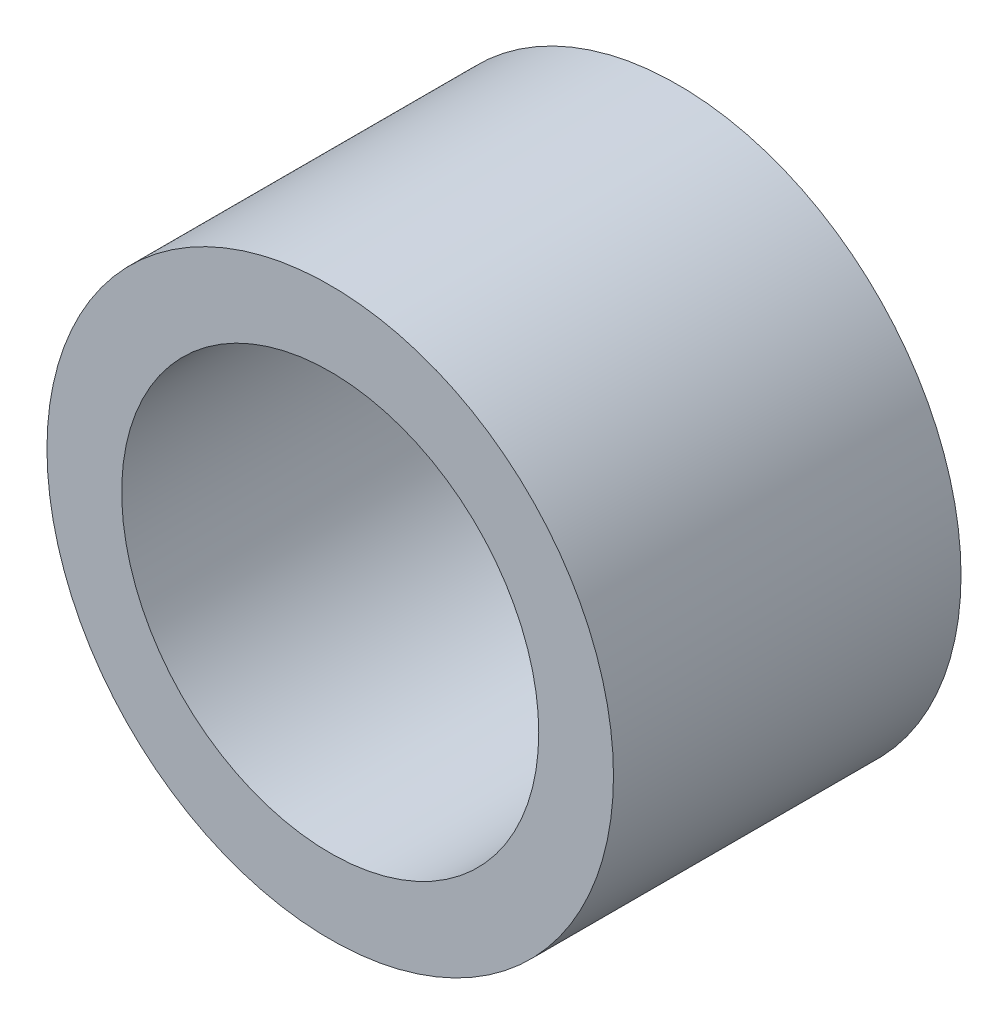
ISO-10303-21;
HEADER;
FILE_DESCRIPTION(('STEP AP214'),'2;1');
FILE_NAME('part.step','',(''),(''),'','','');
FILE_SCHEMA(('AUTOMOTIVE_DESIGN { 1 0 10303 214 1 1 1 1 }'));
ENDSEC;
DATA;
#1=APPLICATION_CONTEXT('core data for automotive mechanical design processes');
#2=APPLICATION_PROTOCOL_DEFINITION('international standard','automotive_design',2000,#1);
#3=PRODUCT_CONTEXT('',#1,'mechanical');
#4=PRODUCT('Part','Part','',(#3));
#5=PRODUCT_RELATED_PRODUCT_CATEGORY('part','',(#4));
#6=PRODUCT_DEFINITION_FORMATION('','',#4);
#7=PRODUCT_DEFINITION_CONTEXT('part definition',#1,'design');
#8=PRODUCT_DEFINITION('design','',#6,#7);
#9=PRODUCT_DEFINITION_SHAPE('','',#8);
#10=(LENGTH_UNIT() NAMED_UNIT(*) SI_UNIT(.MILLI.,.METRE.));
#11=(NAMED_UNIT(*) PLANE_ANGLE_UNIT() SI_UNIT($,.RADIAN.));
#12=(NAMED_UNIT(*) SI_UNIT($,.STERADIAN.) SOLID_ANGLE_UNIT());
#13=UNCERTAINTY_MEASURE_WITH_UNIT(LENGTH_MEASURE(1.E-05),#10,'distance_accuracy_value','');
#14=(GEOMETRIC_REPRESENTATION_CONTEXT(3) GLOBAL_UNCERTAINTY_ASSIGNED_CONTEXT((#13)) GLOBAL_UNIT_ASSIGNED_CONTEXT((#10,
#11,#12)) REPRESENTATION_CONTEXT('',''));
#15=CARTESIAN_POINT('',(0.,0.,0.));
#16=DIRECTION('',(0.,0.,1.));
#17=DIRECTION('',(1.,0.,0.));
#18=AXIS2_PLACEMENT_3D('',#15,#16,#17);
#19=CARTESIAN_POINT('',(0.,0.,5.));
#20=DIRECTION('',(0.,0.,1.));
#21=DIRECTION('',(1.,0.,0.));
#22=AXIS2_PLACEMENT_3D('',#19,#20,#21);
#23=PLANE('',#22);
#24=CARTESIAN_POINT('',(0.,0.,5.));
#25=DIRECTION('',(0.,0.,1.));
#26=DIRECTION('',(1.,0.,0.));
#27=AXIS2_PLACEMENT_3D('',#24,#25,#26);
#28=CIRCLE('',#27,4.075);
#29=CARTESIAN_POINT('',(4.075,0.,5.));
#30=VERTEX_POINT('',#29);
#31=EDGE_CURVE('E10',#30,#30,#28,.T.);
#32=ORIENTED_EDGE('',*,*,#31,.T.);
#33=EDGE_LOOP('',(#32));
#34=FACE_BOUND('',#33,.T.);
#35=CARTESIAN_POINT('',(0.,0.,5.));
#36=DIRECTION('',(0.,0.,1.));
#37=DIRECTION('',(1.,0.,0.));
#38=AXIS2_PLACEMENT_3D('',#35,#36,#37);
#39=CIRCLE('',#38,3.);
#40=CARTESIAN_POINT('',(3.,0.,5.));
#41=VERTEX_POINT('',#40);
#42=EDGE_CURVE('E42',#41,#41,#39,.T.);
#43=ORIENTED_EDGE('',*,*,#42,.F.);
#44=EDGE_LOOP('',(#43));
#45=FACE_BOUND('',#44,.T.);
#46=ADVANCED_FACE('F31',(#34,#45),#23,.T.);
#47=CARTESIAN_POINT('',(0.,0.,0.));
#48=DIRECTION('',(0.,0.,1.));
#49=DIRECTION('',(1.,0.,0.));
#50=AXIS2_PLACEMENT_3D('',#47,#48,#49);
#51=PLANE('',#50);
#52=CARTESIAN_POINT('',(0.,0.,0.));
#53=DIRECTION('',(0.,0.,1.));
#54=DIRECTION('',(1.,0.,0.));
#55=AXIS2_PLACEMENT_3D('',#52,#53,#54);
#56=CIRCLE('',#55,4.075);
#57=CARTESIAN_POINT('',(4.075,0.,0.));
#58=VERTEX_POINT('',#57);
#59=EDGE_CURVE('E35',#58,#58,#56,.T.);
#60=ORIENTED_EDGE('',*,*,#59,.F.);
#61=EDGE_LOOP('',(#60));
#62=FACE_BOUND('',#61,.T.);
#63=CARTESIAN_POINT('',(0.,0.,0.));
#64=DIRECTION('',(0.,0.,1.));
#65=DIRECTION('',(1.,0.,0.));
#66=AXIS2_PLACEMENT_3D('',#63,#64,#65);
#67=CIRCLE('',#66,3.);
#68=CARTESIAN_POINT('',(3.,0.,0.));
#69=VERTEX_POINT('',#68);
#70=EDGE_CURVE('E44',#69,#69,#67,.T.);
#71=ORIENTED_EDGE('',*,*,#70,.T.);
#72=EDGE_LOOP('',(#71));
#73=FACE_BOUND('',#72,.T.);
#74=ADVANCED_FACE('F54',(#62,#73),#51,.F.);
#75=CARTESIAN_POINT('',(0.,0.,5.));
#76=DIRECTION('',(0.,0.,-1.));
#77=DIRECTION('',(-1.,0.,0.));
#78=AXIS2_PLACEMENT_3D('',#75,#76,#77);
#79=CYLINDRICAL_SURFACE('',#78,4.075);
#80=ORIENTED_EDGE('',*,*,#31,.F.);
#81=EDGE_LOOP('',(#80));
#82=FACE_BOUND('',#81,.T.);
#83=ORIENTED_EDGE('',*,*,#59,.T.);
#84=EDGE_LOOP('',(#83));
#85=FACE_BOUND('',#84,.T.);
#86=ADVANCED_FACE('F33',(#82,#85),#79,.T.);
#87=CARTESIAN_POINT('',(0.,0.,5.));
#88=DIRECTION('',(0.,0.,-1.));
#89=DIRECTION('',(-1.,0.,0.));
#90=AXIS2_PLACEMENT_3D('',#87,#88,#89);
#91=CYLINDRICAL_SURFACE('',#90,3.);
#92=ORIENTED_EDGE('',*,*,#42,.T.);
#93=EDGE_LOOP('',(#92));
#94=FACE_BOUND('',#93,.T.);
#95=ORIENTED_EDGE('',*,*,#70,.F.);
#96=EDGE_LOOP('',(#95));
#97=FACE_BOUND('',#96,.T.);
#98=ADVANCED_FACE('F50',(#94,#97),#91,.F.);
#99=CLOSED_SHELL('',(#46,#74,#86,#98));
#100=MANIFOLD_SOLID_BREP('B2',#99);
#101=ADVANCED_BREP_SHAPE_REPRESENTATION('',(#18,#100),#14);
#102=SHAPE_DEFINITION_REPRESENTATION(#9,#101);
ENDSEC;
END-ISO-10303-21;
